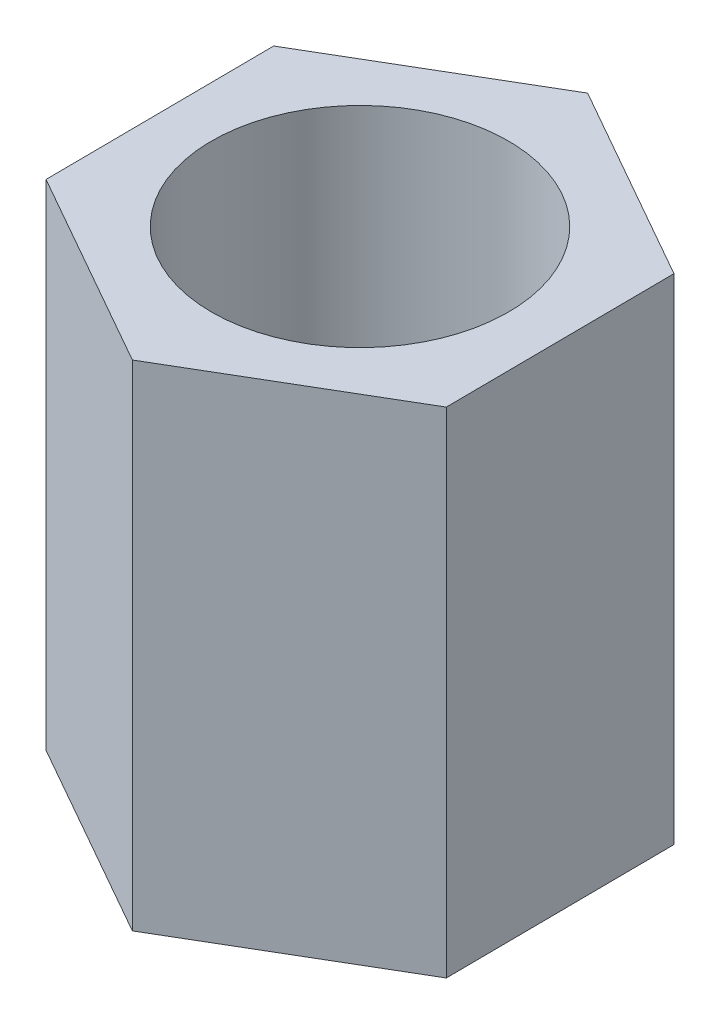
ISO-10303-21;
HEADER;
FILE_DESCRIPTION(('STEP AP214'),'2;1');
FILE_NAME('part.step','',(''),(''),'','','');
FILE_SCHEMA(('AUTOMOTIVE_DESIGN { 1 0 10303 214 1 1 1 1 }'));
ENDSEC;
DATA;
#1=APPLICATION_CONTEXT('core data for automotive mechanical design processes');
#2=APPLICATION_PROTOCOL_DEFINITION('international standard','automotive_design',2000,#1);
#3=PRODUCT_CONTEXT('',#1,'mechanical');
#4=PRODUCT('Part','Part','',(#3));
#5=PRODUCT_RELATED_PRODUCT_CATEGORY('part','',(#4));
#6=PRODUCT_DEFINITION_FORMATION('','',#4);
#7=PRODUCT_DEFINITION_CONTEXT('part definition',#1,'design');
#8=PRODUCT_DEFINITION('design','',#6,#7);
#9=PRODUCT_DEFINITION_SHAPE('','',#8);
#10=(LENGTH_UNIT() NAMED_UNIT(*) SI_UNIT(.MILLI.,.METRE.));
#11=(NAMED_UNIT(*) PLANE_ANGLE_UNIT() SI_UNIT($,.RADIAN.));
#12=(NAMED_UNIT(*) SI_UNIT($,.STERADIAN.) SOLID_ANGLE_UNIT());
#13=UNCERTAINTY_MEASURE_WITH_UNIT(LENGTH_MEASURE(1.E-05),#10,'distance_accuracy_value','');
#14=(GEOMETRIC_REPRESENTATION_CONTEXT(3) GLOBAL_UNCERTAINTY_ASSIGNED_CONTEXT((#13)) GLOBAL_UNIT_ASSIGNED_CONTEXT((#10,
#11,#12)) REPRESENTATION_CONTEXT('',''));
#15=CARTESIAN_POINT('',(0.,0.,0.));
#16=DIRECTION('',(0.,0.,1.));
#17=DIRECTION('',(1.,0.,0.));
#18=AXIS2_PLACEMENT_3D('',#15,#16,#17);
#19=CARTESIAN_POINT('',(0.,5.,0.));
#20=DIRECTION('',(0.,1.,0.));
#21=DIRECTION('',(0.,0.,1.));
#22=AXIS2_PLACEMENT_3D('',#19,#20,#21);
#23=PLANE('',#22);
#24=DIRECTION('',(-0.00760468626753577,0.,-0.999971083955317));
#25=VECTOR('',#24,1.);
#26=CARTESIAN_POINT('',(2.01764023136981,5.,1.14451594604933));
#27=LINE('',#26,#25);
#28=CARTESIAN_POINT('',(2.01764023136981,5.,1.14451594604933));
#29=VERTEX_POINT('',#28);
#30=CARTESIAN_POINT('',(2.,5.,-1.1750697230391));
#31=VERTEX_POINT('',#30);
#32=EDGE_CURVE('E152',#29,#31,#27,.T.);
#33=ORIENTED_EDGE('',*,*,#32,.T.);
#34=DIRECTION('',(-0.869802704888934,0.,-0.493399690482162));
#35=VECTOR('',#34,1.);
#36=CARTESIAN_POINT('',(2.,5.,-1.1750697230391));
#37=LINE('',#36,#35);
#38=CARTESIAN_POINT('',(-0.0176402313698073,5.,-2.31958566908843));
#39=VERTEX_POINT('',#38);
#40=EDGE_CURVE('E100',#31,#39,#37,.T.);
#41=ORIENTED_EDGE('',*,*,#40,.T.);
#42=DIRECTION('',(-0.862198018621399,0.,0.506571393473155));
#43=VECTOR('',#42,1.);
#44=CARTESIAN_POINT('',(-0.0176402313698073,5.,-2.31958566908843));
#45=LINE('',#44,#43);
#46=CARTESIAN_POINT('',(-2.01764023136981,5.,-1.14451594604933));
#47=VERTEX_POINT('',#46);
#48=EDGE_CURVE('E113',#39,#47,#45,.T.);
#49=ORIENTED_EDGE('',*,*,#48,.T.);
#50=DIRECTION('',(0.0076046862675354,0.,0.999971083955317));
#51=VECTOR('',#50,1.);
#52=CARTESIAN_POINT('',(-2.01764023136981,5.,-1.14451594604933));
#53=LINE('',#52,#51);
#54=CARTESIAN_POINT('',(-2.,5.,1.1750697230391));
#55=VERTEX_POINT('',#54);
#56=EDGE_CURVE('E107',#47,#55,#53,.T.);
#57=ORIENTED_EDGE('',*,*,#56,.T.);
#58=DIRECTION('',(0.869802704888934,0.,0.493399690482163));
#59=VECTOR('',#58,1.);
#60=CARTESIAN_POINT('',(-2.,5.,1.1750697230391));
#61=LINE('',#60,#59);
#62=CARTESIAN_POINT('',(0.0176402313698077,5.,2.31958566908843));
#63=VERTEX_POINT('',#62);
#64=EDGE_CURVE('E111',#55,#63,#61,.T.);
#65=ORIENTED_EDGE('',*,*,#64,.T.);
#66=DIRECTION('',(0.862198018621399,0.,-0.506571393473155));
#67=VECTOR('',#66,1.);
#68=CARTESIAN_POINT('',(0.0176402313698077,5.,2.31958566908843));
#69=LINE('',#68,#67);
#70=EDGE_CURVE('E63',#63,#29,#69,.T.);
#71=ORIENTED_EDGE('',*,*,#70,.T.);
#72=EDGE_LOOP('',(#33,#41,#49,#57,#65,#71));
#73=FACE_BOUND('',#72,.T.);
#74=CARTESIAN_POINT('',(0.,5.,0.));
#75=DIRECTION('',(0.,1.,0.));
#76=DIRECTION('',(0.,0.,1.));
#77=AXIS2_PLACEMENT_3D('',#74,#75,#76);
#78=CIRCLE('',#77,1.5);
#79=CARTESIAN_POINT('',(0.,5.,1.5));
#80=VERTEX_POINT('',#79);
#81=EDGE_CURVE('E140',#80,#80,#78,.T.);
#82=ORIENTED_EDGE('',*,*,#81,.F.);
#83=EDGE_LOOP('',(#82));
#84=FACE_BOUND('',#83,.T.);
#85=ADVANCED_FACE('F45',(#73,#84),#23,.T.);
#86=CARTESIAN_POINT('',(0.,0.,0.));
#87=DIRECTION('',(0.,1.,0.));
#88=DIRECTION('',(0.,0.,1.));
#89=AXIS2_PLACEMENT_3D('',#86,#87,#88);
#90=PLANE('',#89);
#91=DIRECTION('',(-0.00760468626753577,0.,-0.999971083955317));
#92=VECTOR('',#91,1.);
#93=CARTESIAN_POINT('',(2.01764023136981,0.,1.14451594604933));
#94=LINE('',#93,#92);
#95=CARTESIAN_POINT('',(2.01764023136981,0.,1.14451594604933));
#96=VERTEX_POINT('',#95);
#97=CARTESIAN_POINT('',(2.,0.,-1.1750697230391));
#98=VERTEX_POINT('',#97);
#99=EDGE_CURVE('E135',#96,#98,#94,.T.);
#100=ORIENTED_EDGE('',*,*,#99,.F.);
#101=DIRECTION('',(0.862198018621399,0.,-0.506571393473155));
#102=VECTOR('',#101,1.);
#103=CARTESIAN_POINT('',(0.0176402313698077,0.,2.31958566908843));
#104=LINE('',#103,#102);
#105=CARTESIAN_POINT('',(0.0176402313698077,0.,2.31958566908843));
#106=VERTEX_POINT('',#105);
#107=EDGE_CURVE('E92',#106,#96,#104,.T.);
#108=ORIENTED_EDGE('',*,*,#107,.F.);
#109=DIRECTION('',(0.869802704888934,0.,0.493399690482163));
#110=VECTOR('',#109,1.);
#111=CARTESIAN_POINT('',(-2.,0.,1.1750697230391));
#112=LINE('',#111,#110);
#113=CARTESIAN_POINT('',(-2.,0.,1.1750697230391));
#114=VERTEX_POINT('',#113);
#115=EDGE_CURVE('E86',#114,#106,#112,.T.);
#116=ORIENTED_EDGE('',*,*,#115,.F.);
#117=DIRECTION('',(0.0076046862675354,0.,0.999971083955317));
#118=VECTOR('',#117,1.);
#119=CARTESIAN_POINT('',(-2.01764023136981,0.,-1.14451594604933));
#120=LINE('',#119,#118);
#121=CARTESIAN_POINT('',(-2.01764023136981,0.,-1.14451594604933));
#122=VERTEX_POINT('',#121);
#123=EDGE_CURVE('E122',#122,#114,#120,.T.);
#124=ORIENTED_EDGE('',*,*,#123,.F.);
#125=DIRECTION('',(-0.862198018621399,0.,0.506571393473155));
#126=VECTOR('',#125,1.);
#127=CARTESIAN_POINT('',(-0.0176402313698073,0.,-2.31958566908843));
#128=LINE('',#127,#126);
#129=CARTESIAN_POINT('',(-0.0176402313698073,0.,-2.31958566908843));
#130=VERTEX_POINT('',#129);
#131=EDGE_CURVE('E143',#130,#122,#128,.T.);
#132=ORIENTED_EDGE('',*,*,#131,.F.);
#133=DIRECTION('',(-0.869802704888934,0.,-0.493399690482162));
#134=VECTOR('',#133,1.);
#135=CARTESIAN_POINT('',(2.,0.,-1.1750697230391));
#136=LINE('',#135,#134);
#137=EDGE_CURVE('E139',#98,#130,#136,.T.);
#138=ORIENTED_EDGE('',*,*,#137,.F.);
#139=EDGE_LOOP('',(#100,#108,#116,#124,#132,#138));
#140=FACE_BOUND('',#139,.T.);
#141=CARTESIAN_POINT('',(0.,0.,0.));
#142=DIRECTION('',(0.,1.,0.));
#143=DIRECTION('',(0.,0.,1.));
#144=AXIS2_PLACEMENT_3D('',#141,#142,#143);
#145=CIRCLE('',#144,1.5);
#146=CARTESIAN_POINT('',(0.,0.,1.5));
#147=VERTEX_POINT('',#146);
#148=EDGE_CURVE('E249',#147,#147,#145,.T.);
#149=ORIENTED_EDGE('',*,*,#148,.T.);
#150=EDGE_LOOP('',(#149));
#151=FACE_BOUND('',#150,.T.);
#152=ADVANCED_FACE('F165',(#140,#151),#90,.F.);
#153=CARTESIAN_POINT('',(2.01764023136981,5.,1.14451594604933));
#154=DIRECTION('',(-0.999971083955317,0.,0.00760468626753577));
#155=DIRECTION('',(0.00760468626753577,0.,0.999971083955317));
#156=AXIS2_PLACEMENT_3D('',#153,#154,#155);
#157=PLANE('',#156);
#158=ORIENTED_EDGE('',*,*,#99,.T.);
#159=DIRECTION('',(0.,-1.,0.));
#160=VECTOR('',#159,1.);
#161=CARTESIAN_POINT('',(2.,5.,-1.1750697230391));
#162=LINE('',#161,#160);
#163=EDGE_CURVE('E11',#31,#98,#162,.T.);
#164=ORIENTED_EDGE('',*,*,#163,.F.);
#165=ORIENTED_EDGE('',*,*,#32,.F.);
#166=DIRECTION('',(0.,-1.,0.));
#167=VECTOR('',#166,1.);
#168=CARTESIAN_POINT('',(2.01764023136981,5.,1.14451594604933));
#169=LINE('',#168,#167);
#170=EDGE_CURVE('E131',#29,#96,#169,.T.);
#171=ORIENTED_EDGE('',*,*,#170,.T.);
#172=EDGE_LOOP('',(#158,#164,#165,#171));
#173=FACE_BOUND('',#172,.T.);
#174=ADVANCED_FACE('F47',(#173),#157,.F.);
#175=CARTESIAN_POINT('',(2.,5.,-1.1750697230391));
#176=DIRECTION('',(-0.493399690482162,0.,0.869802704888934));
#177=DIRECTION('',(0.869802704888934,0.,0.493399690482163));
#178=AXIS2_PLACEMENT_3D('',#175,#176,#177);
#179=PLANE('',#178);
#180=ORIENTED_EDGE('',*,*,#137,.T.);
#181=DIRECTION('',(0.,-1.,0.));
#182=VECTOR('',#181,1.);
#183=CARTESIAN_POINT('',(-0.0176402313698073,5.,-2.31958566908843));
#184=LINE('',#183,#182);
#185=EDGE_CURVE('E55',#39,#130,#184,.T.);
#186=ORIENTED_EDGE('',*,*,#185,.F.);
#187=ORIENTED_EDGE('',*,*,#40,.F.);
#188=ORIENTED_EDGE('',*,*,#163,.T.);
#189=EDGE_LOOP('',(#180,#186,#187,#188));
#190=FACE_BOUND('',#189,.T.);
#191=ADVANCED_FACE('F190',(#190),#179,.F.);
#192=CARTESIAN_POINT('',(-0.0176402313698073,5.,-2.31958566908843));
#193=DIRECTION('',(0.506571393473155,0.,0.862198018621399));
#194=DIRECTION('',(0.862198018621399,0.,-0.506571393473155));
#195=AXIS2_PLACEMENT_3D('',#192,#193,#194);
#196=PLANE('',#195);
#197=ORIENTED_EDGE('',*,*,#131,.T.);
#198=DIRECTION('',(0.,-1.,0.));
#199=VECTOR('',#198,1.);
#200=CARTESIAN_POINT('',(-2.01764023136981,5.,-1.14451594604933));
#201=LINE('',#200,#199);
#202=EDGE_CURVE('E124',#47,#122,#201,.T.);
#203=ORIENTED_EDGE('',*,*,#202,.F.);
#204=ORIENTED_EDGE('',*,*,#48,.F.);
#205=ORIENTED_EDGE('',*,*,#185,.T.);
#206=EDGE_LOOP('',(#197,#203,#204,#205));
#207=FACE_BOUND('',#206,.T.);
#208=ADVANCED_FACE('F162',(#207),#196,.F.);
#209=CARTESIAN_POINT('',(-2.01764023136981,5.,-1.14451594604933));
#210=DIRECTION('',(0.999971083955317,0.,-0.0076046862675354));
#211=DIRECTION('',(-0.0076046862675354,0.,-0.999971083955317));
#212=AXIS2_PLACEMENT_3D('',#209,#210,#211);
#213=PLANE('',#212);
#214=ORIENTED_EDGE('',*,*,#123,.T.);
#215=DIRECTION('',(0.,-1.,0.));
#216=VECTOR('',#215,1.);
#217=CARTESIAN_POINT('',(-2.,5.,1.1750697230391));
#218=LINE('',#217,#216);
#219=EDGE_CURVE('E119',#55,#114,#218,.T.);
#220=ORIENTED_EDGE('',*,*,#219,.F.);
#221=ORIENTED_EDGE('',*,*,#56,.F.);
#222=ORIENTED_EDGE('',*,*,#202,.T.);
#223=EDGE_LOOP('',(#214,#220,#221,#222));
#224=FACE_BOUND('',#223,.T.);
#225=ADVANCED_FACE('F120',(#224),#213,.F.);
#226=CARTESIAN_POINT('',(-2.,5.,1.1750697230391));
#227=DIRECTION('',(0.493399690482163,0.,-0.869802704888934));
#228=DIRECTION('',(-0.869802704888934,0.,-0.493399690482163));
#229=AXIS2_PLACEMENT_3D('',#226,#227,#228);
#230=PLANE('',#229);
#231=ORIENTED_EDGE('',*,*,#115,.T.);
#232=DIRECTION('',(0.,-1.,0.));
#233=VECTOR('',#232,1.);
#234=CARTESIAN_POINT('',(0.0176402313698077,5.,2.31958566908843));
#235=LINE('',#234,#233);
#236=EDGE_CURVE('E125',#63,#106,#235,.T.);
#237=ORIENTED_EDGE('',*,*,#236,.F.);
#238=ORIENTED_EDGE('',*,*,#64,.F.);
#239=ORIENTED_EDGE('',*,*,#219,.T.);
#240=EDGE_LOOP('',(#231,#237,#238,#239));
#241=FACE_BOUND('',#240,.T.);
#242=ADVANCED_FACE('F127',(#241),#230,.F.);
#243=CARTESIAN_POINT('',(0.0176402313698077,5.,2.31958566908843));
#244=DIRECTION('',(-0.506571393473155,0.,-0.862198018621399));
#245=DIRECTION('',(-0.862198018621399,0.,0.506571393473155));
#246=AXIS2_PLACEMENT_3D('',#243,#244,#245);
#247=PLANE('',#246);
#248=ORIENTED_EDGE('',*,*,#107,.T.);
#249=ORIENTED_EDGE('',*,*,#170,.F.);
#250=ORIENTED_EDGE('',*,*,#70,.F.);
#251=ORIENTED_EDGE('',*,*,#236,.T.);
#252=EDGE_LOOP('',(#248,#249,#250,#251));
#253=FACE_BOUND('',#252,.T.);
#254=ADVANCED_FACE('F170',(#253),#247,.F.);
#255=CARTESIAN_POINT('',(0.,5.,0.));
#256=DIRECTION('',(0.,-1.,0.));
#257=DIRECTION('',(0.,0.,-1.));
#258=AXIS2_PLACEMENT_3D('',#255,#256,#257);
#259=CYLINDRICAL_SURFACE('',#258,1.5);
#260=ORIENTED_EDGE('',*,*,#81,.T.);
#261=EDGE_LOOP('',(#260));
#262=FACE_BOUND('',#261,.T.);
#263=ORIENTED_EDGE('',*,*,#148,.F.);
#264=EDGE_LOOP('',(#263));
#265=FACE_BOUND('',#264,.T.);
#266=ADVANCED_FACE('F172',(#262,#265),#259,.F.);
#267=CLOSED_SHELL('',(#85,#152,#174,#191,#208,#225,#242,#254,#266));
#268=MANIFOLD_SOLID_BREP('B2',#267);
#269=ADVANCED_BREP_SHAPE_REPRESENTATION('',(#18,#268),#14);
#270=SHAPE_DEFINITION_REPRESENTATION(#9,#269);
ENDSEC;
END-ISO-10303-21;
